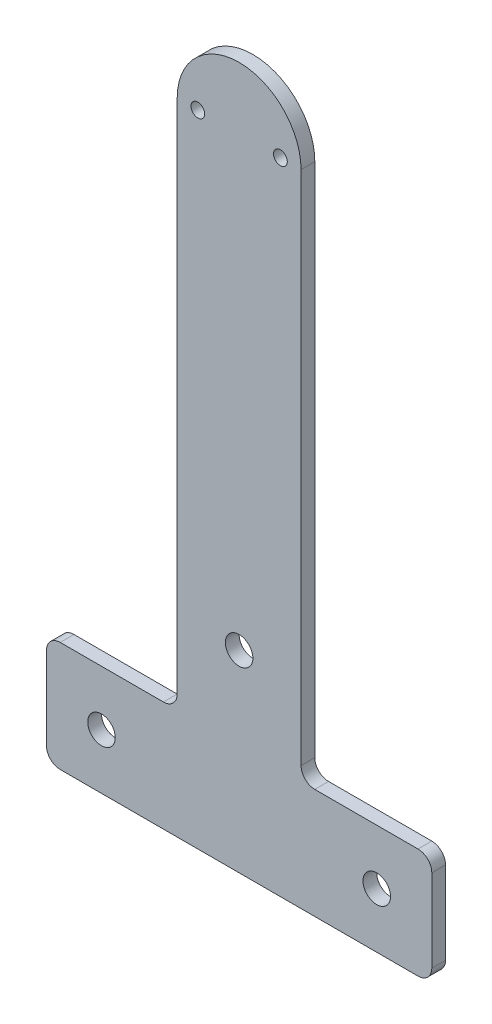
ISO-10303-21;
HEADER;
FILE_DESCRIPTION(('STEP AP214'),'2;1');
FILE_NAME('part.step','',(''),(''),'','','');
FILE_SCHEMA(('AUTOMOTIVE_DESIGN { 1 0 10303 214 1 1 1 1 }'));
ENDSEC;
DATA;
#1=APPLICATION_CONTEXT('core data for automotive mechanical design processes');
#2=APPLICATION_PROTOCOL_DEFINITION('international standard','automotive_design',2000,#1);
#3=PRODUCT_CONTEXT('',#1,'mechanical');
#4=PRODUCT('Part','Part','',(#3));
#5=PRODUCT_RELATED_PRODUCT_CATEGORY('part','',(#4));
#6=PRODUCT_DEFINITION_FORMATION('','',#4);
#7=PRODUCT_DEFINITION_CONTEXT('part definition',#1,'design');
#8=PRODUCT_DEFINITION('design','',#6,#7);
#9=PRODUCT_DEFINITION_SHAPE('','',#8);
#10=(LENGTH_UNIT() NAMED_UNIT(*) SI_UNIT(.MILLI.,.METRE.));
#11=(NAMED_UNIT(*) PLANE_ANGLE_UNIT() SI_UNIT($,.RADIAN.));
#12=(NAMED_UNIT(*) SI_UNIT($,.STERADIAN.) SOLID_ANGLE_UNIT());
#13=UNCERTAINTY_MEASURE_WITH_UNIT(LENGTH_MEASURE(1.E-05),#10,'distance_accuracy_value','');
#14=(GEOMETRIC_REPRESENTATION_CONTEXT(3) GLOBAL_UNCERTAINTY_ASSIGNED_CONTEXT((#13)) GLOBAL_UNIT_ASSIGNED_CONTEXT((#10,
#11,#12)) REPRESENTATION_CONTEXT('',''));
#15=CARTESIAN_POINT('',(0.,0.,0.));
#16=DIRECTION('',(0.,0.,1.));
#17=DIRECTION('',(1.,0.,0.));
#18=AXIS2_PLACEMENT_3D('',#15,#16,#17);
#19=CARTESIAN_POINT('',(-13.3404490284892,112.565520937774,2.));
#20=DIRECTION('',(0.,0.,-1.));
#21=DIRECTION('',(-1.,0.,0.));
#22=AXIS2_PLACEMENT_3D('',#19,#20,#21);
#23=PLANE('',#22);
#24=DIRECTION('',(0.,1.,0.));
#25=VECTOR('',#24,1.);
#26=CARTESIAN_POINT('',(14.6595509715108,19.5655209377735,2.));
#27=LINE('',#26,#25);
#28=CARTESIAN_POINT('',(14.6595509715108,21.5655209377735,2.));
#29=VERTEX_POINT('',#28);
#30=CARTESIAN_POINT('',(14.6595509715108,33.5655209377735,2.));
#31=VERTEX_POINT('',#30);
#32=EDGE_CURVE('E276',#29,#31,#27,.T.);
#33=ORIENTED_EDGE('',*,*,#32,.T.);
#34=CARTESIAN_POINT('',(12.6595509715108,33.5655209377735,2.));
#35=DIRECTION('',(0.,0.,-1.));
#36=DIRECTION('',(-1.,0.,0.));
#37=AXIS2_PLACEMENT_3D('',#34,#35,#36);
#38=CIRCLE('',#37,2.);
#39=CARTESIAN_POINT('',(12.6595509715108,35.5655209377735,2.));
#40=VERTEX_POINT('',#39);
#41=EDGE_CURVE('E224',#31,#40,#38,.F.);
#42=ORIENTED_EDGE('',*,*,#41,.T.);
#43=DIRECTION('',(-1.,0.,0.));
#44=VECTOR('',#43,1.);
#45=CARTESIAN_POINT('',(-4.34044902848922,35.5655209377735,2.));
#46=LINE('',#45,#44);
#47=CARTESIAN_POINT('',(-2.34044902848922,35.5655209377735,2.));
#48=VERTEX_POINT('',#47);
#49=EDGE_CURVE('E153',#40,#48,#46,.T.);
#50=ORIENTED_EDGE('',*,*,#49,.T.);
#51=CARTESIAN_POINT('',(-2.34044902848922,37.5655209377735,2.));
#52=DIRECTION('',(0.,0.,-1.));
#53=DIRECTION('',(-1.,0.,0.));
#54=AXIS2_PLACEMENT_3D('',#51,#52,#53);
#55=CIRCLE('',#54,2.);
#56=CARTESIAN_POINT('',(-4.34044902848922,37.5655209377735,2.));
#57=VERTEX_POINT('',#56);
#58=EDGE_CURVE('E149',#48,#57,#55,.T.);
#59=ORIENTED_EDGE('',*,*,#58,.T.);
#60=DIRECTION('',(0.,1.,0.));
#61=VECTOR('',#60,1.);
#62=CARTESIAN_POINT('',(-4.34044902848921,112.565520937774,2.));
#63=LINE('',#62,#61);
#64=CARTESIAN_POINT('',(-4.34044902848921,112.565520937774,2.));
#65=VERTEX_POINT('',#64);
#66=EDGE_CURVE('E139',#57,#65,#63,.T.);
#67=ORIENTED_EDGE('',*,*,#66,.T.);
#68=CARTESIAN_POINT('',(-13.3404490284892,112.565520937774,2.));
#69=DIRECTION('',(0.,0.,1.));
#70=DIRECTION('',(-1.,0.,0.));
#71=AXIS2_PLACEMENT_3D('',#68,#69,#70);
#72=CIRCLE('',#71,9.00000000000001);
#73=CARTESIAN_POINT('',(-22.3404490284892,112.565520937774,2.));
#74=VERTEX_POINT('',#73);
#75=EDGE_CURVE('E145',#65,#74,#72,.T.);
#76=ORIENTED_EDGE('',*,*,#75,.T.);
#77=DIRECTION('',(0.,-1.,0.));
#78=VECTOR('',#77,1.);
#79=CARTESIAN_POINT('',(-22.3404490284892,112.565520937774,2.));
#80=LINE('',#79,#78);
#81=CARTESIAN_POINT('',(-22.3404490284892,37.5655209377735,2.));
#82=VERTEX_POINT('',#81);
#83=EDGE_CURVE('E168',#74,#82,#80,.T.);
#84=ORIENTED_EDGE('',*,*,#83,.T.);
#85=CARTESIAN_POINT('',(-24.3404490284892,37.5655209377735,2.));
#86=DIRECTION('',(0.,0.,-1.));
#87=DIRECTION('',(-1.,0.,0.));
#88=AXIS2_PLACEMENT_3D('',#85,#86,#87);
#89=CIRCLE('',#88,2.);
#90=CARTESIAN_POINT('',(-24.3404490284892,35.5655209377735,2.));
#91=VERTEX_POINT('',#90);
#92=EDGE_CURVE('E11',#82,#91,#89,.T.);
#93=ORIENTED_EDGE('',*,*,#92,.T.);
#94=DIRECTION('',(-1.,0.,0.));
#95=VECTOR('',#94,1.);
#96=CARTESIAN_POINT('',(-41.3404490284892,35.5655209377735,2.));
#97=LINE('',#96,#95);
#98=CARTESIAN_POINT('',(-39.3404490284892,35.5655209377735,2.));
#99=VERTEX_POINT('',#98);
#100=EDGE_CURVE('E170',#91,#99,#97,.T.);
#101=ORIENTED_EDGE('',*,*,#100,.T.);
#102=CARTESIAN_POINT('',(-39.3404490284892,33.5655209377735,2.));
#103=DIRECTION('',(0.,0.,-1.));
#104=DIRECTION('',(-1.,0.,0.));
#105=AXIS2_PLACEMENT_3D('',#102,#103,#104);
#106=CIRCLE('',#105,2.);
#107=CARTESIAN_POINT('',(-41.3404490284892,33.5655209377735,2.));
#108=VERTEX_POINT('',#107);
#109=EDGE_CURVE('E61',#99,#108,#106,.F.);
#110=ORIENTED_EDGE('',*,*,#109,.T.);
#111=DIRECTION('',(0.,-1.,0.));
#112=VECTOR('',#111,1.);
#113=CARTESIAN_POINT('',(-41.3404490284892,19.5655209377735,2.));
#114=LINE('',#113,#112);
#115=CARTESIAN_POINT('',(-41.3404490284892,21.5655209377735,2.));
#116=VERTEX_POINT('',#115);
#117=EDGE_CURVE('E175',#108,#116,#114,.T.);
#118=ORIENTED_EDGE('',*,*,#117,.T.);
#119=CARTESIAN_POINT('',(-39.3404490284892,21.5655209377735,2.));
#120=DIRECTION('',(0.,0.,-1.));
#121=DIRECTION('',(-1.,0.,0.));
#122=AXIS2_PLACEMENT_3D('',#119,#120,#121);
#123=CIRCLE('',#122,2.);
#124=CARTESIAN_POINT('',(-39.3404490284892,19.5655209377735,2.));
#125=VERTEX_POINT('',#124);
#126=EDGE_CURVE('E220',#116,#125,#123,.F.);
#127=ORIENTED_EDGE('',*,*,#126,.T.);
#128=DIRECTION('',(1.,0.,0.));
#129=VECTOR('',#128,1.);
#130=CARTESIAN_POINT('',(-41.3404490284892,19.5655209377735,2.));
#131=LINE('',#130,#129);
#132=CARTESIAN_POINT('',(12.6595509715108,19.5655209377735,2.));
#133=VERTEX_POINT('',#132);
#134=EDGE_CURVE('E198',#125,#133,#131,.T.);
#135=ORIENTED_EDGE('',*,*,#134,.T.);
#136=CARTESIAN_POINT('',(12.6595509715108,21.5655209377735,2.));
#137=DIRECTION('',(0.,0.,-1.));
#138=DIRECTION('',(-1.,0.,0.));
#139=AXIS2_PLACEMENT_3D('',#136,#137,#138);
#140=CIRCLE('',#139,2.);
#141=EDGE_CURVE('E222',#133,#29,#140,.F.);
#142=ORIENTED_EDGE('',*,*,#141,.T.);
#143=EDGE_LOOP('',(#33,#42,#50,#59,#67,#76,#84,#93,#101,#110,#118,#127,#135,#142));
#144=FACE_BOUND('',#143,.T.);
#145=CARTESIAN_POINT('',(-33.3404490284892,27.5655209377735,2.));
#146=DIRECTION('',(0.,0.,1.));
#147=DIRECTION('',(1.,0.,0.));
#148=AXIS2_PLACEMENT_3D('',#145,#146,#147);
#149=CIRCLE('',#148,2.);
#150=CARTESIAN_POINT('',(-31.3404490284892,27.5655209377735,2.));
#151=VERTEX_POINT('',#150);
#152=EDGE_CURVE('E181',#151,#151,#149,.T.);
#153=ORIENTED_EDGE('',*,*,#152,.F.);
#154=EDGE_LOOP('',(#153));
#155=FACE_BOUND('',#154,.T.);
#156=CARTESIAN_POINT('',(6.65955097151078,27.5655209377735,2.));
#157=DIRECTION('',(0.,0.,1.));
#158=DIRECTION('',(-1.,0.,0.));
#159=AXIS2_PLACEMENT_3D('',#156,#157,#158);
#160=CIRCLE('',#159,2.00000000000001);
#161=CARTESIAN_POINT('',(4.65955097151077,27.5655209377735,2.));
#162=VERTEX_POINT('',#161);
#163=EDGE_CURVE('E364',#162,#162,#160,.T.);
#164=ORIENTED_EDGE('',*,*,#163,.F.);
#165=EDGE_LOOP('',(#164));
#166=FACE_BOUND('',#165,.T.);
#167=CARTESIAN_POINT('',(-7.34044902848922,112.565520937774,2.));
#168=DIRECTION('',(0.,0.,1.));
#169=DIRECTION('',(1.,0.,0.));
#170=AXIS2_PLACEMENT_3D('',#167,#168,#169);
#171=CIRCLE('',#170,1.);
#172=CARTESIAN_POINT('',(-6.34044902848922,112.565520937774,2.));
#173=VERTEX_POINT('',#172);
#174=EDGE_CURVE('E369',#173,#173,#171,.T.);
#175=ORIENTED_EDGE('',*,*,#174,.F.);
#176=EDGE_LOOP('',(#175));
#177=FACE_BOUND('',#176,.T.);
#178=CARTESIAN_POINT('',(-19.3404490284892,112.565520937774,2.));
#179=DIRECTION('',(0.,0.,1.));
#180=DIRECTION('',(-1.,0.,0.));
#181=AXIS2_PLACEMENT_3D('',#178,#179,#180);
#182=CIRCLE('',#181,1.);
#183=CARTESIAN_POINT('',(-20.3404490284892,112.565520937774,2.));
#184=VERTEX_POINT('',#183);
#185=EDGE_CURVE('E393',#184,#184,#182,.T.);
#186=ORIENTED_EDGE('',*,*,#185,.F.);
#187=EDGE_LOOP('',(#186));
#188=FACE_BOUND('',#187,.T.);
#189=CARTESIAN_POINT('',(-13.3404490284892,47.5655209377735,2.));
#190=DIRECTION('',(0.,0.,1.));
#191=DIRECTION('',(1.,0.,0.));
#192=AXIS2_PLACEMENT_3D('',#189,#190,#191);
#193=CIRCLE('',#192,2.00000000000001);
#194=CARTESIAN_POINT('',(-11.3404490284892,47.5655209377735,2.));
#195=VERTEX_POINT('',#194);
#196=EDGE_CURVE('E388',#195,#195,#193,.T.);
#197=ORIENTED_EDGE('',*,*,#196,.F.);
#198=EDGE_LOOP('',(#197));
#199=FACE_BOUND('',#198,.T.);
#200=ADVANCED_FACE('F39',(#144,#155,#166,#177,#188,#199),#23,.F.);
#201=CARTESIAN_POINT('',(-13.3404490284892,112.565520937774,0.));
#202=DIRECTION('',(0.,0.,-1.));
#203=DIRECTION('',(-1.,0.,0.));
#204=AXIS2_PLACEMENT_3D('',#201,#202,#203);
#205=PLANE('',#204);
#206=CARTESIAN_POINT('',(-19.3404490284892,112.565520937774,0.));
#207=DIRECTION('',(0.,0.,1.));
#208=DIRECTION('',(-1.,0.,0.));
#209=AXIS2_PLACEMENT_3D('',#206,#207,#208);
#210=CIRCLE('',#209,1.);
#211=CARTESIAN_POINT('',(-20.3404490284892,112.565520937774,0.));
#212=VERTEX_POINT('',#211);
#213=EDGE_CURVE('E390',#212,#212,#210,.T.);
#214=ORIENTED_EDGE('',*,*,#213,.T.);
#215=EDGE_LOOP('',(#214));
#216=FACE_BOUND('',#215,.T.);
#217=CARTESIAN_POINT('',(6.65955097151078,27.5655209377735,0.));
#218=DIRECTION('',(0.,0.,1.));
#219=DIRECTION('',(-1.,0.,0.));
#220=AXIS2_PLACEMENT_3D('',#217,#218,#219);
#221=CIRCLE('',#220,2.00000000000001);
#222=CARTESIAN_POINT('',(4.65955097151077,27.5655209377735,0.));
#223=VERTEX_POINT('',#222);
#224=EDGE_CURVE('E367',#223,#223,#221,.T.);
#225=ORIENTED_EDGE('',*,*,#224,.T.);
#226=EDGE_LOOP('',(#225));
#227=FACE_BOUND('',#226,.T.);
#228=DIRECTION('',(-1.,0.,0.));
#229=VECTOR('',#228,1.);
#230=CARTESIAN_POINT('',(-4.34044902848922,35.5655209377735,0.));
#231=LINE('',#230,#229);
#232=CARTESIAN_POINT('',(12.6595509715108,35.5655209377735,0.));
#233=VERTEX_POINT('',#232);
#234=CARTESIAN_POINT('',(-2.34044902848922,35.5655209377735,0.));
#235=VERTEX_POINT('',#234);
#236=EDGE_CURVE('E184',#233,#235,#231,.T.);
#237=ORIENTED_EDGE('',*,*,#236,.F.);
#238=CARTESIAN_POINT('',(12.6595509715108,33.5655209377735,0.));
#239=DIRECTION('',(0.,0.,-1.));
#240=DIRECTION('',(-1.,0.,0.));
#241=AXIS2_PLACEMENT_3D('',#238,#239,#240);
#242=CIRCLE('',#241,2.);
#243=CARTESIAN_POINT('',(14.6595509715108,33.5655209377735,0.));
#244=VERTEX_POINT('',#243);
#245=EDGE_CURVE('E212',#233,#244,#242,.T.);
#246=ORIENTED_EDGE('',*,*,#245,.T.);
#247=DIRECTION('',(0.,1.,0.));
#248=VECTOR('',#247,1.);
#249=CARTESIAN_POINT('',(14.6595509715108,19.5655209377735,0.));
#250=LINE('',#249,#248);
#251=CARTESIAN_POINT('',(14.6595509715108,21.5655209377735,0.));
#252=VERTEX_POINT('',#251);
#253=EDGE_CURVE('E180',#252,#244,#250,.T.);
#254=ORIENTED_EDGE('',*,*,#253,.F.);
#255=CARTESIAN_POINT('',(12.6595509715108,21.5655209377735,0.));
#256=DIRECTION('',(0.,0.,-1.));
#257=DIRECTION('',(-1.,0.,0.));
#258=AXIS2_PLACEMENT_3D('',#255,#256,#257);
#259=CIRCLE('',#258,2.);
#260=CARTESIAN_POINT('',(12.6595509715108,19.5655209377735,0.));
#261=VERTEX_POINT('',#260);
#262=EDGE_CURVE('E210',#252,#261,#259,.T.);
#263=ORIENTED_EDGE('',*,*,#262,.T.);
#264=DIRECTION('',(1.,0.,0.));
#265=VECTOR('',#264,1.);
#266=CARTESIAN_POINT('',(-41.3404490284892,19.5655209377735,0.));
#267=LINE('',#266,#265);
#268=CARTESIAN_POINT('',(-39.3404490284892,19.5655209377735,0.));
#269=VERTEX_POINT('',#268);
#270=EDGE_CURVE('E177',#269,#261,#267,.T.);
#271=ORIENTED_EDGE('',*,*,#270,.F.);
#272=CARTESIAN_POINT('',(-39.3404490284892,21.5655209377735,0.));
#273=DIRECTION('',(0.,0.,-1.));
#274=DIRECTION('',(-1.,0.,0.));
#275=AXIS2_PLACEMENT_3D('',#272,#273,#274);
#276=CIRCLE('',#275,2.);
#277=CARTESIAN_POINT('',(-41.3404490284892,21.5655209377735,0.));
#278=VERTEX_POINT('',#277);
#279=EDGE_CURVE('E208',#269,#278,#276,.T.);
#280=ORIENTED_EDGE('',*,*,#279,.T.);
#281=DIRECTION('',(0.,-1.,0.));
#282=VECTOR('',#281,1.);
#283=CARTESIAN_POINT('',(-41.3404490284892,19.5655209377735,0.));
#284=LINE('',#283,#282);
#285=CARTESIAN_POINT('',(-41.3404490284892,33.5655209377735,0.));
#286=VERTEX_POINT('',#285);
#287=EDGE_CURVE('E196',#286,#278,#284,.T.);
#288=ORIENTED_EDGE('',*,*,#287,.F.);
#289=CARTESIAN_POINT('',(-39.3404490284892,33.5655209377735,0.));
#290=DIRECTION('',(0.,0.,-1.));
#291=DIRECTION('',(-1.,0.,0.));
#292=AXIS2_PLACEMENT_3D('',#289,#290,#291);
#293=CIRCLE('',#292,2.);
#294=CARTESIAN_POINT('',(-39.3404490284892,35.5655209377735,0.));
#295=VERTEX_POINT('',#294);
#296=EDGE_CURVE('E206',#286,#295,#293,.T.);
#297=ORIENTED_EDGE('',*,*,#296,.T.);
#298=DIRECTION('',(-1.,0.,0.));
#299=VECTOR('',#298,1.);
#300=CARTESIAN_POINT('',(-41.3404490284892,35.5655209377735,0.));
#301=LINE('',#300,#299);
#302=CARTESIAN_POINT('',(-24.3404490284892,35.5655209377735,0.));
#303=VERTEX_POINT('',#302);
#304=EDGE_CURVE('E193',#303,#295,#301,.T.);
#305=ORIENTED_EDGE('',*,*,#304,.F.);
#306=CARTESIAN_POINT('',(-24.3404490284892,37.5655209377735,0.));
#307=DIRECTION('',(0.,0.,-1.));
#308=DIRECTION('',(-1.,0.,0.));
#309=AXIS2_PLACEMENT_3D('',#306,#307,#308);
#310=CIRCLE('',#309,2.);
#311=CARTESIAN_POINT('',(-22.3404490284892,37.5655209377735,0.));
#312=VERTEX_POINT('',#311);
#313=EDGE_CURVE('E47',#303,#312,#310,.F.);
#314=ORIENTED_EDGE('',*,*,#313,.T.);
#315=DIRECTION('',(0.,-1.,0.));
#316=VECTOR('',#315,1.);
#317=CARTESIAN_POINT('',(-22.3404490284892,112.565520937774,0.));
#318=LINE('',#317,#316);
#319=CARTESIAN_POINT('',(-22.3404490284892,112.565520937774,0.));
#320=VERTEX_POINT('',#319);
#321=EDGE_CURVE('E190',#320,#312,#318,.T.);
#322=ORIENTED_EDGE('',*,*,#321,.F.);
#323=CARTESIAN_POINT('',(-13.3404490284892,112.565520937774,0.));
#324=DIRECTION('',(0.,0.,1.));
#325=DIRECTION('',(-1.,0.,0.));
#326=AXIS2_PLACEMENT_3D('',#323,#324,#325);
#327=CIRCLE('',#326,9.00000000000001);
#328=CARTESIAN_POINT('',(-4.34044902848921,112.565520937774,0.));
#329=VERTEX_POINT('',#328);
#330=EDGE_CURVE('E188',#329,#320,#327,.T.);
#331=ORIENTED_EDGE('',*,*,#330,.F.);
#332=DIRECTION('',(0.,1.,0.));
#333=VECTOR('',#332,1.);
#334=CARTESIAN_POINT('',(-4.34044902848921,112.565520937774,0.));
#335=LINE('',#334,#333);
#336=CARTESIAN_POINT('',(-4.34044902848922,37.5655209377735,0.));
#337=VERTEX_POINT('',#336);
#338=EDGE_CURVE('E159',#337,#329,#335,.T.);
#339=ORIENTED_EDGE('',*,*,#338,.F.);
#340=CARTESIAN_POINT('',(-2.34044902848922,37.5655209377735,0.));
#341=DIRECTION('',(0.,0.,-1.));
#342=DIRECTION('',(-1.,0.,0.));
#343=AXIS2_PLACEMENT_3D('',#340,#341,#342);
#344=CIRCLE('',#343,2.);
#345=EDGE_CURVE('E242',#337,#235,#344,.F.);
#346=ORIENTED_EDGE('',*,*,#345,.T.);
#347=EDGE_LOOP('',(#237,#246,#254,#263,#271,#280,#288,#297,#305,#314,#322,#331,#339,#346));
#348=FACE_BOUND('',#347,.T.);
#349=CARTESIAN_POINT('',(-33.3404490284892,27.5655209377735,0.));
#350=DIRECTION('',(0.,0.,1.));
#351=DIRECTION('',(1.,0.,0.));
#352=AXIS2_PLACEMENT_3D('',#349,#350,#351);
#353=CIRCLE('',#352,2.);
#354=CARTESIAN_POINT('',(-31.3404490284892,27.5655209377735,0.));
#355=VERTEX_POINT('',#354);
#356=EDGE_CURVE('E280',#355,#355,#353,.T.);
#357=ORIENTED_EDGE('',*,*,#356,.T.);
#358=EDGE_LOOP('',(#357));
#359=FACE_BOUND('',#358,.T.);
#360=CARTESIAN_POINT('',(-7.34044902848922,112.565520937774,0.));
#361=DIRECTION('',(0.,0.,1.));
#362=DIRECTION('',(1.,0.,0.));
#363=AXIS2_PLACEMENT_3D('',#360,#361,#362);
#364=CIRCLE('',#363,1.);
#365=CARTESIAN_POINT('',(-6.34044902848922,112.565520937774,0.));
#366=VERTEX_POINT('',#365);
#367=EDGE_CURVE('E373',#366,#366,#364,.T.);
#368=ORIENTED_EDGE('',*,*,#367,.T.);
#369=EDGE_LOOP('',(#368));
#370=FACE_BOUND('',#369,.T.);
#371=CARTESIAN_POINT('',(-13.3404490284892,47.5655209377735,0.));
#372=DIRECTION('',(0.,0.,1.));
#373=DIRECTION('',(1.,0.,0.));
#374=AXIS2_PLACEMENT_3D('',#371,#372,#373);
#375=CIRCLE('',#374,2.00000000000001);
#376=CARTESIAN_POINT('',(-11.3404490284892,47.5655209377735,0.));
#377=VERTEX_POINT('',#376);
#378=EDGE_CURVE('E387',#377,#377,#375,.T.);
#379=ORIENTED_EDGE('',*,*,#378,.T.);
#380=EDGE_LOOP('',(#379));
#381=FACE_BOUND('',#380,.T.);
#382=ADVANCED_FACE('F248',(#216,#227,#348,#359,#370,#381),#205,.T.);
#383=CARTESIAN_POINT('',(-41.3404490284892,19.5655209377735,2.));
#384=DIRECTION('',(0.,1.,0.));
#385=DIRECTION('',(0.,0.,1.));
#386=AXIS2_PLACEMENT_3D('',#383,#384,#385);
#387=PLANE('',#386);
#388=ORIENTED_EDGE('',*,*,#270,.T.);
#389=DIRECTION('',(0.,0.,-1.));
#390=VECTOR('',#389,1.);
#391=CARTESIAN_POINT('',(12.6595509715108,19.5655209377735,2.));
#392=LINE('',#391,#390);
#393=EDGE_CURVE('E229',#261,#133,#392,.F.);
#394=ORIENTED_EDGE('',*,*,#393,.T.);
#395=ORIENTED_EDGE('',*,*,#134,.F.);
#396=DIRECTION('',(0.,0.,-1.));
#397=VECTOR('',#396,1.);
#398=CARTESIAN_POINT('',(-39.3404490284892,19.5655209377735,2.));
#399=LINE('',#398,#397);
#400=EDGE_CURVE('E226',#125,#269,#399,.T.);
#401=ORIENTED_EDGE('',*,*,#400,.T.);
#402=EDGE_LOOP('',(#388,#394,#395,#401));
#403=FACE_BOUND('',#402,.T.);
#404=ADVANCED_FACE('F272',(#403),#387,.F.);
#405=CARTESIAN_POINT('',(14.6595509715108,19.5655209377735,2.));
#406=DIRECTION('',(-1.,0.,0.));
#407=DIRECTION('',(0.,0.,1.));
#408=AXIS2_PLACEMENT_3D('',#405,#406,#407);
#409=PLANE('',#408);
#410=ORIENTED_EDGE('',*,*,#253,.T.);
#411=DIRECTION('',(0.,0.,-1.));
#412=VECTOR('',#411,1.);
#413=CARTESIAN_POINT('',(14.6595509715108,33.5655209377735,2.));
#414=LINE('',#413,#412);
#415=EDGE_CURVE('E217',#244,#31,#414,.F.);
#416=ORIENTED_EDGE('',*,*,#415,.T.);
#417=ORIENTED_EDGE('',*,*,#32,.F.);
#418=DIRECTION('',(0.,0.,-1.));
#419=VECTOR('',#418,1.);
#420=CARTESIAN_POINT('',(14.6595509715108,21.5655209377735,2.));
#421=LINE('',#420,#419);
#422=EDGE_CURVE('E214',#29,#252,#421,.T.);
#423=ORIENTED_EDGE('',*,*,#422,.T.);
#424=EDGE_LOOP('',(#410,#416,#417,#423));
#425=FACE_BOUND('',#424,.T.);
#426=ADVANCED_FACE('F295',(#425),#409,.F.);
#427=CARTESIAN_POINT('',(-4.34044902848922,35.5655209377735,2.));
#428=DIRECTION('',(0.,-1.,0.));
#429=DIRECTION('',(0.,0.,-1.));
#430=AXIS2_PLACEMENT_3D('',#427,#428,#429);
#431=PLANE('',#430);
#432=ORIENTED_EDGE('',*,*,#236,.T.);
#433=DIRECTION('',(0.,0.,-1.));
#434=VECTOR('',#433,1.);
#435=CARTESIAN_POINT('',(-2.34044902848922,35.5655209377735,2.));
#436=LINE('',#435,#434);
#437=EDGE_CURVE('E204',#235,#48,#436,.F.);
#438=ORIENTED_EDGE('',*,*,#437,.T.);
#439=ORIENTED_EDGE('',*,*,#49,.F.);
#440=DIRECTION('',(0.,0.,-1.));
#441=VECTOR('',#440,1.);
#442=CARTESIAN_POINT('',(12.6595509715108,35.5655209377735,2.));
#443=LINE('',#442,#441);
#444=EDGE_CURVE('E201',#40,#233,#443,.T.);
#445=ORIENTED_EDGE('',*,*,#444,.T.);
#446=EDGE_LOOP('',(#432,#438,#439,#445));
#447=FACE_BOUND('',#446,.T.);
#448=ADVANCED_FACE('F289',(#447),#431,.F.);
#449=CARTESIAN_POINT('',(-4.34044902848921,112.565520937774,2.));
#450=DIRECTION('',(-1.,0.,0.));
#451=DIRECTION('',(0.,-1.,0.));
#452=AXIS2_PLACEMENT_3D('',#449,#450,#451);
#453=PLANE('',#452);
#454=ORIENTED_EDGE('',*,*,#66,.F.);
#455=DIRECTION('',(0.,0.,-1.));
#456=VECTOR('',#455,1.);
#457=CARTESIAN_POINT('',(-4.34044902848922,37.5655209377735,0.));
#458=LINE('',#457,#456);
#459=EDGE_CURVE('E162',#57,#337,#458,.T.);
#460=ORIENTED_EDGE('',*,*,#459,.T.);
#461=ORIENTED_EDGE('',*,*,#338,.T.);
#462=DIRECTION('',(0.,0.,-1.));
#463=VECTOR('',#462,1.);
#464=CARTESIAN_POINT('',(-4.34044902848921,112.565520937774,2.));
#465=LINE('',#464,#463);
#466=EDGE_CURVE('E156',#65,#329,#465,.T.);
#467=ORIENTED_EDGE('',*,*,#466,.F.);
#468=EDGE_LOOP('',(#454,#460,#461,#467));
#469=FACE_BOUND('',#468,.T.);
#470=ADVANCED_FACE('F157',(#469),#453,.F.);
#471=CARTESIAN_POINT('',(-13.3404490284892,112.565520937774,2.));
#472=DIRECTION('',(0.,0.,-1.));
#473=DIRECTION('',(-1.,0.,0.));
#474=AXIS2_PLACEMENT_3D('',#471,#472,#473);
#475=CYLINDRICAL_SURFACE('',#474,9.00000000000001);
#476=ORIENTED_EDGE('',*,*,#330,.T.);
#477=DIRECTION('',(0.,0.,-1.));
#478=VECTOR('',#477,1.);
#479=CARTESIAN_POINT('',(-22.3404490284892,112.565520937774,2.));
#480=LINE('',#479,#478);
#481=EDGE_CURVE('E163',#74,#320,#480,.T.);
#482=ORIENTED_EDGE('',*,*,#481,.F.);
#483=ORIENTED_EDGE('',*,*,#75,.F.);
#484=ORIENTED_EDGE('',*,*,#466,.T.);
#485=EDGE_LOOP('',(#476,#482,#483,#484));
#486=FACE_BOUND('',#485,.T.);
#487=ADVANCED_FACE('F165',(#486),#475,.T.);
#488=CARTESIAN_POINT('',(-22.3404490284892,112.565520937774,2.));
#489=DIRECTION('',(1.,0.,0.));
#490=DIRECTION('',(0.,1.,0.));
#491=AXIS2_PLACEMENT_3D('',#488,#489,#490);
#492=PLANE('',#491);
#493=ORIENTED_EDGE('',*,*,#321,.T.);
#494=DIRECTION('',(0.,0.,-1.));
#495=VECTOR('',#494,1.);
#496=CARTESIAN_POINT('',(-22.3404490284892,37.5655209377735,2.));
#497=LINE('',#496,#495);
#498=EDGE_CURVE('E240',#312,#82,#497,.F.);
#499=ORIENTED_EDGE('',*,*,#498,.T.);
#500=ORIENTED_EDGE('',*,*,#83,.F.);
#501=ORIENTED_EDGE('',*,*,#481,.T.);
#502=EDGE_LOOP('',(#493,#499,#500,#501));
#503=FACE_BOUND('',#502,.T.);
#504=ADVANCED_FACE('F254',(#503),#492,.F.);
#505=CARTESIAN_POINT('',(-41.3404490284892,35.5655209377735,2.));
#506=DIRECTION('',(0.,-1.,0.));
#507=DIRECTION('',(0.,0.,-1.));
#508=AXIS2_PLACEMENT_3D('',#505,#506,#507);
#509=PLANE('',#508);
#510=ORIENTED_EDGE('',*,*,#304,.T.);
#511=DIRECTION('',(0.,0.,-1.));
#512=VECTOR('',#511,1.);
#513=CARTESIAN_POINT('',(-39.3404490284892,35.5655209377735,2.));
#514=LINE('',#513,#512);
#515=EDGE_CURVE('E238',#295,#99,#514,.F.);
#516=ORIENTED_EDGE('',*,*,#515,.T.);
#517=ORIENTED_EDGE('',*,*,#100,.F.);
#518=DIRECTION('',(0.,0.,-1.));
#519=VECTOR('',#518,1.);
#520=CARTESIAN_POINT('',(-24.3404490284892,35.5655209377735,0.));
#521=LINE('',#520,#519);
#522=EDGE_CURVE('E235',#91,#303,#521,.T.);
#523=ORIENTED_EDGE('',*,*,#522,.T.);
#524=EDGE_LOOP('',(#510,#516,#517,#523));
#525=FACE_BOUND('',#524,.T.);
#526=ADVANCED_FACE('F258',(#525),#509,.F.);
#527=CARTESIAN_POINT('',(-41.3404490284892,19.5655209377735,2.));
#528=DIRECTION('',(1.,0.,0.));
#529=DIRECTION('',(0.,0.,-1.));
#530=AXIS2_PLACEMENT_3D('',#527,#528,#529);
#531=PLANE('',#530);
#532=ORIENTED_EDGE('',*,*,#287,.T.);
#533=DIRECTION('',(0.,0.,-1.));
#534=VECTOR('',#533,1.);
#535=CARTESIAN_POINT('',(-41.3404490284892,21.5655209377735,2.));
#536=LINE('',#535,#534);
#537=EDGE_CURVE('E54',#278,#116,#536,.F.);
#538=ORIENTED_EDGE('',*,*,#537,.T.);
#539=ORIENTED_EDGE('',*,*,#117,.F.);
#540=DIRECTION('',(0.,0.,-1.));
#541=VECTOR('',#540,1.);
#542=CARTESIAN_POINT('',(-41.3404490284892,33.5655209377735,2.));
#543=LINE('',#542,#541);
#544=EDGE_CURVE('E231',#108,#286,#543,.T.);
#545=ORIENTED_EDGE('',*,*,#544,.T.);
#546=EDGE_LOOP('',(#532,#538,#539,#545));
#547=FACE_BOUND('',#546,.T.);
#548=ADVANCED_FACE('F264',(#547),#531,.F.);
#549=CARTESIAN_POINT('',(-33.3404490284892,27.5655209377735,2.));
#550=DIRECTION('',(0.,0.,-1.));
#551=DIRECTION('',(-1.,0.,0.));
#552=AXIS2_PLACEMENT_3D('',#549,#550,#551);
#553=CYLINDRICAL_SURFACE('',#552,2.);
#554=ORIENTED_EDGE('',*,*,#152,.T.);
#555=EDGE_LOOP('',(#554));
#556=FACE_BOUND('',#555,.T.);
#557=ORIENTED_EDGE('',*,*,#356,.F.);
#558=EDGE_LOOP('',(#557));
#559=FACE_BOUND('',#558,.T.);
#560=ADVANCED_FACE('F317',(#556,#559),#553,.F.);
#561=CARTESIAN_POINT('',(6.65955097151078,27.5655209377735,2.));
#562=DIRECTION('',(0.,0.,-1.));
#563=DIRECTION('',(-1.,0.,0.));
#564=AXIS2_PLACEMENT_3D('',#561,#562,#563);
#565=CYLINDRICAL_SURFACE('',#564,2.00000000000001);
#566=ORIENTED_EDGE('',*,*,#163,.T.);
#567=EDGE_LOOP('',(#566));
#568=FACE_BOUND('',#567,.T.);
#569=ORIENTED_EDGE('',*,*,#224,.F.);
#570=EDGE_LOOP('',(#569));
#571=FACE_BOUND('',#570,.T.);
#572=ADVANCED_FACE('F353',(#568,#571),#565,.F.);
#573=CARTESIAN_POINT('',(-7.34044902848922,112.565520937774,2.));
#574=DIRECTION('',(0.,0.,-1.));
#575=DIRECTION('',(-1.,0.,0.));
#576=AXIS2_PLACEMENT_3D('',#573,#574,#575);
#577=CYLINDRICAL_SURFACE('',#576,1.);
#578=ORIENTED_EDGE('',*,*,#174,.T.);
#579=EDGE_LOOP('',(#578));
#580=FACE_BOUND('',#579,.T.);
#581=ORIENTED_EDGE('',*,*,#367,.F.);
#582=EDGE_LOOP('',(#581));
#583=FACE_BOUND('',#582,.T.);
#584=ADVANCED_FACE('F346',(#580,#583),#577,.F.);
#585=CARTESIAN_POINT('',(-19.3404490284892,112.565520937774,2.));
#586=DIRECTION('',(0.,0.,-1.));
#587=DIRECTION('',(-1.,0.,0.));
#588=AXIS2_PLACEMENT_3D('',#585,#586,#587);
#589=CYLINDRICAL_SURFACE('',#588,1.);
#590=ORIENTED_EDGE('',*,*,#185,.T.);
#591=EDGE_LOOP('',(#590));
#592=FACE_BOUND('',#591,.T.);
#593=ORIENTED_EDGE('',*,*,#213,.F.);
#594=EDGE_LOOP('',(#593));
#595=FACE_BOUND('',#594,.T.);
#596=ADVANCED_FACE('F341',(#592,#595),#589,.F.);
#597=CARTESIAN_POINT('',(-13.3404490284892,47.5655209377735,2.));
#598=DIRECTION('',(0.,0.,-1.));
#599=DIRECTION('',(-1.,0.,0.));
#600=AXIS2_PLACEMENT_3D('',#597,#598,#599);
#601=CYLINDRICAL_SURFACE('',#600,2.00000000000001);
#602=ORIENTED_EDGE('',*,*,#196,.T.);
#603=EDGE_LOOP('',(#602));
#604=FACE_BOUND('',#603,.T.);
#605=ORIENTED_EDGE('',*,*,#378,.F.);
#606=EDGE_LOOP('',(#605));
#607=FACE_BOUND('',#606,.T.);
#608=ADVANCED_FACE('F337',(#604,#607),#601,.F.);
#609=CARTESIAN_POINT('',(-2.34044902848922,37.5655209377735,2.));
#610=DIRECTION('',(0.,0.,1.));
#611=DIRECTION('',(1.,0.,0.));
#612=AXIS2_PLACEMENT_3D('',#609,#610,#611);
#613=CYLINDRICAL_SURFACE('',#612,2.);
#614=ORIENTED_EDGE('',*,*,#58,.F.);
#615=ORIENTED_EDGE('',*,*,#437,.F.);
#616=ORIENTED_EDGE('',*,*,#345,.F.);
#617=ORIENTED_EDGE('',*,*,#459,.F.);
#618=EDGE_LOOP('',(#614,#615,#616,#617));
#619=FACE_BOUND('',#618,.T.);
#620=ADVANCED_FACE('F288',(#619),#613,.F.);
#621=CARTESIAN_POINT('',(12.6595509715108,33.5655209377735,2.));
#622=DIRECTION('',(0.,0.,-1.));
#623=DIRECTION('',(-1.,0.,0.));
#624=AXIS2_PLACEMENT_3D('',#621,#622,#623);
#625=CYLINDRICAL_SURFACE('',#624,2.);
#626=ORIENTED_EDGE('',*,*,#41,.F.);
#627=ORIENTED_EDGE('',*,*,#415,.F.);
#628=ORIENTED_EDGE('',*,*,#245,.F.);
#629=ORIENTED_EDGE('',*,*,#444,.F.);
#630=EDGE_LOOP('',(#626,#627,#628,#629));
#631=FACE_BOUND('',#630,.T.);
#632=ADVANCED_FACE('F291',(#631),#625,.T.);
#633=CARTESIAN_POINT('',(12.6595509715108,21.5655209377735,2.));
#634=DIRECTION('',(0.,0.,-1.));
#635=DIRECTION('',(-1.,0.,0.));
#636=AXIS2_PLACEMENT_3D('',#633,#634,#635);
#637=CYLINDRICAL_SURFACE('',#636,2.);
#638=ORIENTED_EDGE('',*,*,#141,.F.);
#639=ORIENTED_EDGE('',*,*,#393,.F.);
#640=ORIENTED_EDGE('',*,*,#262,.F.);
#641=ORIENTED_EDGE('',*,*,#422,.F.);
#642=EDGE_LOOP('',(#638,#639,#640,#641));
#643=FACE_BOUND('',#642,.T.);
#644=ADVANCED_FACE('F299',(#643),#637,.T.);
#645=CARTESIAN_POINT('',(-39.3404490284892,21.5655209377735,2.));
#646=DIRECTION('',(0.,0.,-1.));
#647=DIRECTION('',(-1.,0.,0.));
#648=AXIS2_PLACEMENT_3D('',#645,#646,#647);
#649=CYLINDRICAL_SURFACE('',#648,2.);
#650=ORIENTED_EDGE('',*,*,#126,.F.);
#651=ORIENTED_EDGE('',*,*,#537,.F.);
#652=ORIENTED_EDGE('',*,*,#279,.F.);
#653=ORIENTED_EDGE('',*,*,#400,.F.);
#654=EDGE_LOOP('',(#650,#651,#652,#653));
#655=FACE_BOUND('',#654,.T.);
#656=ADVANCED_FACE('F269',(#655),#649,.T.);
#657=CARTESIAN_POINT('',(-39.3404490284892,33.5655209377735,2.));
#658=DIRECTION('',(0.,0.,-1.));
#659=DIRECTION('',(-1.,0.,0.));
#660=AXIS2_PLACEMENT_3D('',#657,#658,#659);
#661=CYLINDRICAL_SURFACE('',#660,2.);
#662=ORIENTED_EDGE('',*,*,#109,.F.);
#663=ORIENTED_EDGE('',*,*,#515,.F.);
#664=ORIENTED_EDGE('',*,*,#296,.F.);
#665=ORIENTED_EDGE('',*,*,#544,.F.);
#666=EDGE_LOOP('',(#662,#663,#664,#665));
#667=FACE_BOUND('',#666,.T.);
#668=ADVANCED_FACE('F261',(#667),#661,.T.);
#669=CARTESIAN_POINT('',(-24.3404490284892,37.5655209377735,2.));
#670=DIRECTION('',(0.,0.,1.));
#671=DIRECTION('',(1.,0.,0.));
#672=AXIS2_PLACEMENT_3D('',#669,#670,#671);
#673=CYLINDRICAL_SURFACE('',#672,2.);
#674=ORIENTED_EDGE('',*,*,#92,.F.);
#675=ORIENTED_EDGE('',*,*,#498,.F.);
#676=ORIENTED_EDGE('',*,*,#313,.F.);
#677=ORIENTED_EDGE('',*,*,#522,.F.);
#678=EDGE_LOOP('',(#674,#675,#676,#677));
#679=FACE_BOUND('',#678,.T.);
#680=ADVANCED_FACE('F41',(#679),#673,.F.);
#681=CLOSED_SHELL('',(#200,#382,#404,#426,#448,#470,#487,#504,#526,#548,#560,#572,#584,#596,
#608,#620,#632,#644,#656,#668,#680));
#682=MANIFOLD_SOLID_BREP('B2',#681);
#683=ADVANCED_BREP_SHAPE_REPRESENTATION('',(#18,#682),#14);
#684=SHAPE_DEFINITION_REPRESENTATION(#9,#683);
ENDSEC;
END-ISO-10303-21;
